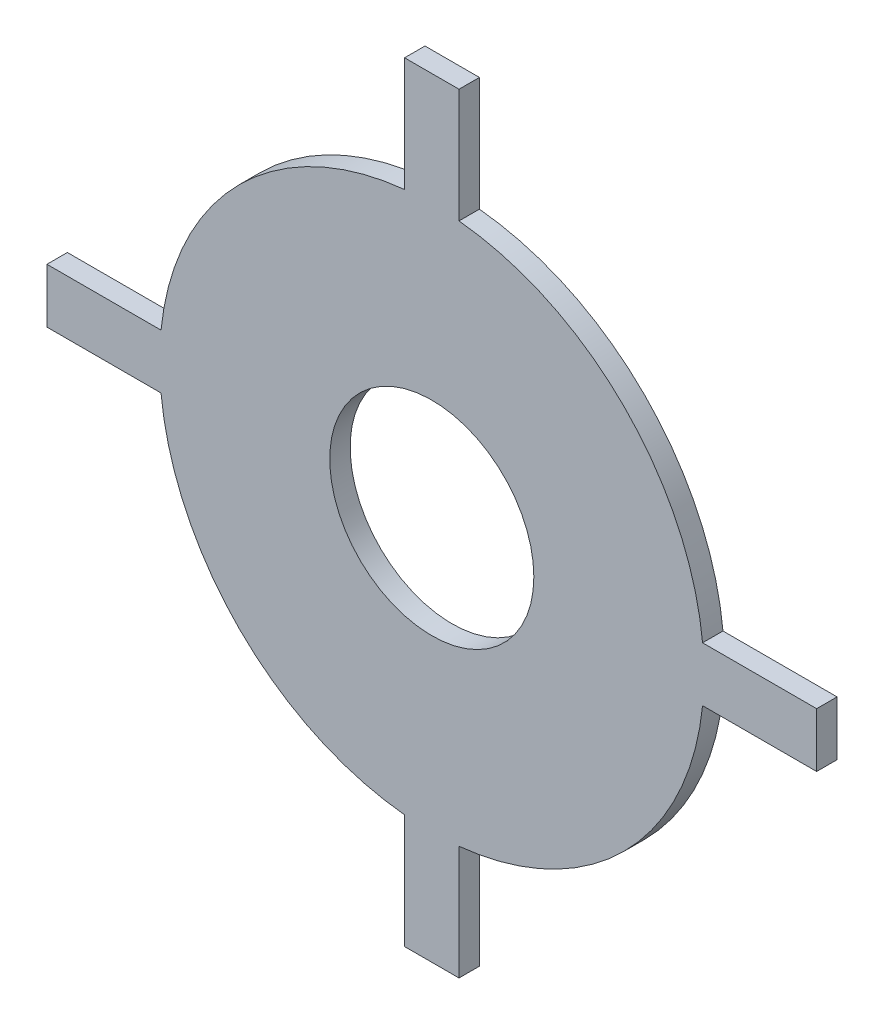
ISO-10303-21;
HEADER;
FILE_DESCRIPTION(('STEP AP214'),'2;1');
FILE_NAME('part.step','',(''),(''),'','','');
FILE_SCHEMA(('AUTOMOTIVE_DESIGN { 1 0 10303 214 1 1 1 1 }'));
ENDSEC;
DATA;
#1=APPLICATION_CONTEXT('core data for automotive mechanical design processes');
#2=APPLICATION_PROTOCOL_DEFINITION('international standard','automotive_design',2000,#1);
#3=PRODUCT_CONTEXT('',#1,'mechanical');
#4=PRODUCT('Part','Part','',(#3));
#5=PRODUCT_RELATED_PRODUCT_CATEGORY('part','',(#4));
#6=PRODUCT_DEFINITION_FORMATION('','',#4);
#7=PRODUCT_DEFINITION_CONTEXT('part definition',#1,'design');
#8=PRODUCT_DEFINITION('design','',#6,#7);
#9=PRODUCT_DEFINITION_SHAPE('','',#8);
#10=(LENGTH_UNIT() NAMED_UNIT(*) SI_UNIT(.MILLI.,.METRE.));
#11=(NAMED_UNIT(*) PLANE_ANGLE_UNIT() SI_UNIT($,.RADIAN.));
#12=(NAMED_UNIT(*) SI_UNIT($,.STERADIAN.) SOLID_ANGLE_UNIT());
#13=UNCERTAINTY_MEASURE_WITH_UNIT(LENGTH_MEASURE(1.E-05),#10,'distance_accuracy_value','');
#14=(GEOMETRIC_REPRESENTATION_CONTEXT(3) GLOBAL_UNCERTAINTY_ASSIGNED_CONTEXT((#13)) GLOBAL_UNIT_ASSIGNED_CONTEXT((#10,
#11,#12)) REPRESENTATION_CONTEXT('',''));
#15=CARTESIAN_POINT('',(0.,0.,0.));
#16=DIRECTION('',(0.,0.,1.));
#17=DIRECTION('',(1.,0.,0.));
#18=AXIS2_PLACEMENT_3D('',#15,#16,#17);
#19=CARTESIAN_POINT('',(0.,0.,1.5));
#20=DIRECTION('',(0.,0.,-1.));
#21=DIRECTION('',(-1.,0.,0.));
#22=AXIS2_PLACEMENT_3D('',#19,#20,#21);
#23=CYLINDRICAL_SURFACE('',#22,20.);
#24=DIRECTION('',(0.,0.,-1.));
#25=VECTOR('',#24,1.);
#26=CARTESIAN_POINT('',(19.8997487421324,-2.,1.5));
#27=LINE('',#26,#25);
#28=CARTESIAN_POINT('',(19.8997487421324,-2.,1.5));
#29=VERTEX_POINT('',#28);
#30=CARTESIAN_POINT('',(19.8997487421324,-2.,0.));
#31=VERTEX_POINT('',#30);
#32=EDGE_CURVE('E11',#29,#31,#27,.T.);
#33=ORIENTED_EDGE('',*,*,#32,.F.);
#34=CARTESIAN_POINT('',(0.,0.,1.5));
#35=DIRECTION('',(0.,0.,1.));
#36=DIRECTION('',(1.,0.,0.));
#37=AXIS2_PLACEMENT_3D('',#34,#35,#36);
#38=CIRCLE('',#37,20.);
#39=CARTESIAN_POINT('',(1.99999999999999,-19.8997487421324,1.5));
#40=VERTEX_POINT('',#39);
#41=EDGE_CURVE('E157',#40,#29,#38,.T.);
#42=ORIENTED_EDGE('',*,*,#41,.F.);
#43=DIRECTION('',(0.,0.,-1.));
#44=VECTOR('',#43,1.);
#45=CARTESIAN_POINT('',(1.99999999999999,-19.8997487421324,1.5));
#46=LINE('',#45,#44);
#47=CARTESIAN_POINT('',(1.99999999999999,-19.8997487421324,0.));
#48=VERTEX_POINT('',#47);
#49=EDGE_CURVE('E56',#48,#40,#46,.F.);
#50=ORIENTED_EDGE('',*,*,#49,.F.);
#51=CARTESIAN_POINT('',(0.,0.,0.));
#52=DIRECTION('',(0.,0.,1.));
#53=DIRECTION('',(1.,0.,0.));
#54=AXIS2_PLACEMENT_3D('',#51,#52,#53);
#55=CIRCLE('',#54,20.);
#56=EDGE_CURVE('E54',#48,#31,#55,.T.);
#57=ORIENTED_EDGE('',*,*,#56,.T.);
#58=EDGE_LOOP('',(#33,#42,#50,#57));
#59=FACE_BOUND('',#58,.T.);
#60=ADVANCED_FACE('F41',(#59),#23,.T.);
#61=DIRECTION('',(0.,0.,-1.));
#62=VECTOR('',#61,1.);
#63=CARTESIAN_POINT('',(19.8997487421324,2.,1.5));
#64=LINE('',#63,#62);
#65=CARTESIAN_POINT('',(19.8997487421324,2.,0.));
#66=VERTEX_POINT('',#65);
#67=CARTESIAN_POINT('',(19.8997487421324,2.,1.5));
#68=VERTEX_POINT('',#67);
#69=EDGE_CURVE('E48',#66,#68,#64,.F.);
#70=ORIENTED_EDGE('',*,*,#69,.F.);
#71=CARTESIAN_POINT('',(2.,19.8997487421324,0.));
#72=VERTEX_POINT('',#71);
#73=EDGE_CURVE('E255',#66,#72,#55,.T.);
#74=ORIENTED_EDGE('',*,*,#73,.T.);
#75=DIRECTION('',(0.,0.,-1.));
#76=VECTOR('',#75,1.);
#77=CARTESIAN_POINT('',(2.,19.8997487421324,1.5));
#78=LINE('',#77,#76);
#79=CARTESIAN_POINT('',(2.,19.8997487421324,1.5));
#80=VERTEX_POINT('',#79);
#81=EDGE_CURVE('E269',#80,#72,#78,.T.);
#82=ORIENTED_EDGE('',*,*,#81,.F.);
#83=EDGE_CURVE('E248',#68,#80,#38,.T.);
#84=ORIENTED_EDGE('',*,*,#83,.F.);
#85=EDGE_LOOP('',(#70,#74,#82,#84));
#86=FACE_BOUND('',#85,.T.);
#87=ADVANCED_FACE('F344',(#86),#23,.T.);
#88=DIRECTION('',(0.,0.,-1.));
#89=VECTOR('',#88,1.);
#90=CARTESIAN_POINT('',(-2.,19.8997487421324,1.5));
#91=LINE('',#90,#89);
#92=CARTESIAN_POINT('',(-2.,19.8997487421324,0.));
#93=VERTEX_POINT('',#92);
#94=CARTESIAN_POINT('',(-2.,19.8997487421324,1.5));
#95=VERTEX_POINT('',#94);
#96=EDGE_CURVE('E270',#93,#95,#91,.F.);
#97=ORIENTED_EDGE('',*,*,#96,.F.);
#98=CARTESIAN_POINT('',(-19.8997487421324,2.,0.));
#99=VERTEX_POINT('',#98);
#100=EDGE_CURVE('E258',#93,#99,#55,.T.);
#101=ORIENTED_EDGE('',*,*,#100,.T.);
#102=DIRECTION('',(0.,0.,-1.));
#103=VECTOR('',#102,1.);
#104=CARTESIAN_POINT('',(-19.8997487421324,2.,1.5));
#105=LINE('',#104,#103);
#106=CARTESIAN_POINT('',(-19.8997487421324,2.,1.5));
#107=VERTEX_POINT('',#106);
#108=EDGE_CURVE('E262',#107,#99,#105,.T.);
#109=ORIENTED_EDGE('',*,*,#108,.F.);
#110=EDGE_CURVE('E251',#95,#107,#38,.T.);
#111=ORIENTED_EDGE('',*,*,#110,.F.);
#112=EDGE_LOOP('',(#97,#101,#109,#111));
#113=FACE_BOUND('',#112,.T.);
#114=ADVANCED_FACE('F298',(#113),#23,.T.);
#115=DIRECTION('',(0.,0.,-1.));
#116=VECTOR('',#115,1.);
#117=CARTESIAN_POINT('',(-19.8997487421324,-2.,1.5));
#118=LINE('',#117,#116);
#119=CARTESIAN_POINT('',(-19.8997487421324,-2.,0.));
#120=VERTEX_POINT('',#119);
#121=CARTESIAN_POINT('',(-19.8997487421324,-2.,1.5));
#122=VERTEX_POINT('',#121);
#123=EDGE_CURVE('E261',#120,#122,#118,.F.);
#124=ORIENTED_EDGE('',*,*,#123,.F.);
#125=CARTESIAN_POINT('',(-2.,-19.8997487421324,0.));
#126=VERTEX_POINT('',#125);
#127=EDGE_CURVE('E305',#120,#126,#55,.T.);
#128=ORIENTED_EDGE('',*,*,#127,.T.);
#129=DIRECTION('',(0.,0.,-1.));
#130=VECTOR('',#129,1.);
#131=CARTESIAN_POINT('',(-2.,-19.8997487421324,1.5));
#132=LINE('',#131,#130);
#133=CARTESIAN_POINT('',(-2.,-19.8997487421324,1.5));
#134=VERTEX_POINT('',#133);
#135=EDGE_CURVE('E256',#134,#126,#132,.T.);
#136=ORIENTED_EDGE('',*,*,#135,.F.);
#137=EDGE_CURVE('E319',#122,#134,#38,.T.);
#138=ORIENTED_EDGE('',*,*,#137,.F.);
#139=EDGE_LOOP('',(#124,#128,#136,#138));
#140=FACE_BOUND('',#139,.T.);
#141=ADVANCED_FACE('F303',(#140),#23,.T.);
#142=CARTESIAN_POINT('',(0.,0.,1.5));
#143=DIRECTION('',(0.,0.,1.));
#144=DIRECTION('',(1.,0.,0.));
#145=AXIS2_PLACEMENT_3D('',#142,#143,#144);
#146=PLANE('',#145);
#147=ORIENTED_EDGE('',*,*,#41,.T.);
#148=DIRECTION('',(1.,0.,0.));
#149=VECTOR('',#148,1.);
#150=CARTESIAN_POINT('',(19.,-2.,1.5));
#151=LINE('',#150,#149);
#152=CARTESIAN_POINT('',(28.2842712474619,-2.,1.5));
#153=VERTEX_POINT('',#152);
#154=EDGE_CURVE('E147',#29,#153,#151,.T.);
#155=ORIENTED_EDGE('',*,*,#154,.T.);
#156=DIRECTION('',(0.,1.,0.));
#157=VECTOR('',#156,1.);
#158=CARTESIAN_POINT('',(28.2842712474619,-2.,1.5));
#159=LINE('',#158,#157);
#160=CARTESIAN_POINT('',(28.2842712474619,2.,1.5));
#161=VERTEX_POINT('',#160);
#162=EDGE_CURVE('E156',#153,#161,#159,.T.);
#163=ORIENTED_EDGE('',*,*,#162,.T.);
#164=DIRECTION('',(-1.,0.,0.));
#165=VECTOR('',#164,1.);
#166=CARTESIAN_POINT('',(19.,2.,1.5));
#167=LINE('',#166,#165);
#168=EDGE_CURVE('E177',#161,#68,#167,.T.);
#169=ORIENTED_EDGE('',*,*,#168,.T.);
#170=ORIENTED_EDGE('',*,*,#83,.T.);
#171=DIRECTION('',(0.,1.,0.));
#172=VECTOR('',#171,1.);
#173=CARTESIAN_POINT('',(2.,19.,1.5));
#174=LINE('',#173,#172);
#175=CARTESIAN_POINT('',(2.,28.2842712474619,1.5));
#176=VERTEX_POINT('',#175);
#177=EDGE_CURVE('E200',#80,#176,#174,.T.);
#178=ORIENTED_EDGE('',*,*,#177,.T.);
#179=DIRECTION('',(-1.,0.,0.));
#180=VECTOR('',#179,1.);
#181=CARTESIAN_POINT('',(2.,28.2842712474619,1.5));
#182=LINE('',#181,#180);
#183=CARTESIAN_POINT('',(-2.,28.2842712474619,1.5));
#184=VERTEX_POINT('',#183);
#185=EDGE_CURVE('E204',#176,#184,#182,.T.);
#186=ORIENTED_EDGE('',*,*,#185,.T.);
#187=DIRECTION('',(0.,-1.,0.));
#188=VECTOR('',#187,1.);
#189=CARTESIAN_POINT('',(-2.,19.,1.5));
#190=LINE('',#189,#188);
#191=EDGE_CURVE('E191',#184,#95,#190,.T.);
#192=ORIENTED_EDGE('',*,*,#191,.T.);
#193=ORIENTED_EDGE('',*,*,#110,.T.);
#194=DIRECTION('',(-1.,0.,0.));
#195=VECTOR('',#194,1.);
#196=CARTESIAN_POINT('',(-19.,2.,1.5));
#197=LINE('',#196,#195);
#198=CARTESIAN_POINT('',(-28.2842712474619,2.,1.5));
#199=VERTEX_POINT('',#198);
#200=EDGE_CURVE('E218',#107,#199,#197,.T.);
#201=ORIENTED_EDGE('',*,*,#200,.T.);
#202=DIRECTION('',(0.,-1.,0.));
#203=VECTOR('',#202,1.);
#204=CARTESIAN_POINT('',(-28.2842712474619,2.,1.5));
#205=LINE('',#204,#203);
#206=CARTESIAN_POINT('',(-28.2842712474619,-2.,1.5));
#207=VERTEX_POINT('',#206);
#208=EDGE_CURVE('E221',#199,#207,#205,.T.);
#209=ORIENTED_EDGE('',*,*,#208,.T.);
#210=DIRECTION('',(1.,0.,0.));
#211=VECTOR('',#210,1.);
#212=CARTESIAN_POINT('',(-19.,-2.,1.5));
#213=LINE('',#212,#211);
#214=EDGE_CURVE('E212',#207,#122,#213,.T.);
#215=ORIENTED_EDGE('',*,*,#214,.T.);
#216=ORIENTED_EDGE('',*,*,#137,.T.);
#217=DIRECTION('',(0.,-1.,0.));
#218=VECTOR('',#217,1.);
#219=CARTESIAN_POINT('',(-2.,-19.,1.5));
#220=LINE('',#219,#218);
#221=CARTESIAN_POINT('',(-2.,-28.2842712474619,1.5));
#222=VERTEX_POINT('',#221);
#223=EDGE_CURVE('E236',#134,#222,#220,.T.);
#224=ORIENTED_EDGE('',*,*,#223,.T.);
#225=DIRECTION('',(1.,0.,0.));
#226=VECTOR('',#225,1.);
#227=CARTESIAN_POINT('',(-2.,-28.2842712474619,1.5));
#228=LINE('',#227,#226);
#229=CARTESIAN_POINT('',(1.99999999999999,-28.2842712474619,1.5));
#230=VERTEX_POINT('',#229);
#231=EDGE_CURVE('E244',#222,#230,#228,.T.);
#232=ORIENTED_EDGE('',*,*,#231,.T.);
#233=DIRECTION('',(0.,1.,0.));
#234=VECTOR('',#233,1.);
#235=CARTESIAN_POINT('',(1.99999999999999,-19.,1.5));
#236=LINE('',#235,#234);
#237=EDGE_CURVE('E234',#230,#40,#236,.T.);
#238=ORIENTED_EDGE('',*,*,#237,.T.);
#239=EDGE_LOOP('',(#147,#155,#163,#169,#170,#178,#186,#192,#193,#201,#209,#215,#216,#224,#232,#238));
#240=FACE_BOUND('',#239,.T.);
#241=CARTESIAN_POINT('',(0.,0.,1.5));
#242=DIRECTION('',(0.,0.,1.));
#243=DIRECTION('',(1.,0.,0.));
#244=AXIS2_PLACEMENT_3D('',#241,#242,#243);
#245=CIRCLE('',#244,7.5);
#246=CARTESIAN_POINT('',(7.5,0.,1.5));
#247=VERTEX_POINT('',#246);
#248=EDGE_CURVE('E241',#247,#247,#245,.T.);
#249=ORIENTED_EDGE('',*,*,#248,.F.);
#250=EDGE_LOOP('',(#249));
#251=FACE_BOUND('',#250,.T.);
#252=ADVANCED_FACE('F155',(#240,#251),#146,.T.);
#253=CARTESIAN_POINT('',(0.,0.,0.));
#254=DIRECTION('',(0.,0.,1.));
#255=DIRECTION('',(1.,0.,0.));
#256=AXIS2_PLACEMENT_3D('',#253,#254,#255);
#257=PLANE('',#256);
#258=ORIENTED_EDGE('',*,*,#73,.F.);
#259=DIRECTION('',(-1.,0.,0.));
#260=VECTOR('',#259,1.);
#261=CARTESIAN_POINT('',(19.,2.,0.));
#262=LINE('',#261,#260);
#263=CARTESIAN_POINT('',(28.2842712474619,2.,0.));
#264=VERTEX_POINT('',#263);
#265=EDGE_CURVE('E161',#264,#66,#262,.T.);
#266=ORIENTED_EDGE('',*,*,#265,.F.);
#267=DIRECTION('',(0.,1.,0.));
#268=VECTOR('',#267,1.);
#269=CARTESIAN_POINT('',(28.2842712474619,-2.,0.));
#270=LINE('',#269,#268);
#271=CARTESIAN_POINT('',(28.2842712474619,-2.,0.));
#272=VERTEX_POINT('',#271);
#273=EDGE_CURVE('E182',#272,#264,#270,.T.);
#274=ORIENTED_EDGE('',*,*,#273,.F.);
#275=DIRECTION('',(1.,0.,0.));
#276=VECTOR('',#275,1.);
#277=CARTESIAN_POINT('',(19.,-2.,0.));
#278=LINE('',#277,#276);
#279=EDGE_CURVE('E170',#31,#272,#278,.T.);
#280=ORIENTED_EDGE('',*,*,#279,.F.);
#281=ORIENTED_EDGE('',*,*,#56,.F.);
#282=DIRECTION('',(0.,1.,0.));
#283=VECTOR('',#282,1.);
#284=CARTESIAN_POINT('',(1.99999999999999,-19.,0.));
#285=LINE('',#284,#283);
#286=CARTESIAN_POINT('',(1.99999999999999,-28.2842712474619,0.));
#287=VERTEX_POINT('',#286);
#288=EDGE_CURVE('E231',#287,#48,#285,.T.);
#289=ORIENTED_EDGE('',*,*,#288,.F.);
#290=DIRECTION('',(1.,0.,0.));
#291=VECTOR('',#290,1.);
#292=CARTESIAN_POINT('',(-2.,-28.2842712474619,0.));
#293=LINE('',#292,#291);
#294=CARTESIAN_POINT('',(-2.,-28.2842712474619,0.));
#295=VERTEX_POINT('',#294);
#296=EDGE_CURVE('E240',#295,#287,#293,.T.);
#297=ORIENTED_EDGE('',*,*,#296,.F.);
#298=DIRECTION('',(0.,-1.,0.));
#299=VECTOR('',#298,1.);
#300=CARTESIAN_POINT('',(-2.,-19.,0.));
#301=LINE('',#300,#299);
#302=EDGE_CURVE('E211',#126,#295,#301,.T.);
#303=ORIENTED_EDGE('',*,*,#302,.F.);
#304=ORIENTED_EDGE('',*,*,#127,.F.);
#305=DIRECTION('',(1.,0.,0.));
#306=VECTOR('',#305,1.);
#307=CARTESIAN_POINT('',(-19.,-2.,0.));
#308=LINE('',#307,#306);
#309=CARTESIAN_POINT('',(-28.2842712474619,-2.,0.));
#310=VERTEX_POINT('',#309);
#311=EDGE_CURVE('E214',#310,#120,#308,.T.);
#312=ORIENTED_EDGE('',*,*,#311,.F.);
#313=DIRECTION('',(0.,-1.,0.));
#314=VECTOR('',#313,1.);
#315=CARTESIAN_POINT('',(-28.2842712474619,2.,0.));
#316=LINE('',#315,#314);
#317=CARTESIAN_POINT('',(-28.2842712474619,2.,0.));
#318=VERTEX_POINT('',#317);
#319=EDGE_CURVE('E217',#318,#310,#316,.T.);
#320=ORIENTED_EDGE('',*,*,#319,.F.);
#321=DIRECTION('',(-1.,0.,0.));
#322=VECTOR('',#321,1.);
#323=CARTESIAN_POINT('',(-19.,2.,0.));
#324=LINE('',#323,#322);
#325=EDGE_CURVE('E192',#99,#318,#324,.T.);
#326=ORIENTED_EDGE('',*,*,#325,.F.);
#327=ORIENTED_EDGE('',*,*,#100,.F.);
#328=DIRECTION('',(0.,-1.,0.));
#329=VECTOR('',#328,1.);
#330=CARTESIAN_POINT('',(-2.,19.,0.));
#331=LINE('',#330,#329);
#332=CARTESIAN_POINT('',(-2.,28.2842712474619,0.));
#333=VERTEX_POINT('',#332);
#334=EDGE_CURVE('E193',#333,#93,#331,.T.);
#335=ORIENTED_EDGE('',*,*,#334,.F.);
#336=DIRECTION('',(-1.,0.,0.));
#337=VECTOR('',#336,1.);
#338=CARTESIAN_POINT('',(2.,28.2842712474619,0.));
#339=LINE('',#338,#337);
#340=CARTESIAN_POINT('',(2.,28.2842712474619,0.));
#341=VERTEX_POINT('',#340);
#342=EDGE_CURVE('E196',#341,#333,#339,.T.);
#343=ORIENTED_EDGE('',*,*,#342,.F.);
#344=DIRECTION('',(0.,1.,0.));
#345=VECTOR('',#344,1.);
#346=CARTESIAN_POINT('',(2.,19.,0.));
#347=LINE('',#346,#345);
#348=EDGE_CURVE('E185',#72,#341,#347,.T.);
#349=ORIENTED_EDGE('',*,*,#348,.F.);
#350=EDGE_LOOP('',(#258,#266,#274,#280,#281,#289,#297,#303,#304,#312,#320,#326,#327,#335,#343,#349));
#351=FACE_BOUND('',#350,.T.);
#352=CARTESIAN_POINT('',(0.,0.,0.));
#353=DIRECTION('',(0.,0.,1.));
#354=DIRECTION('',(1.,0.,0.));
#355=AXIS2_PLACEMENT_3D('',#352,#353,#354);
#356=CIRCLE('',#355,7.5);
#357=CARTESIAN_POINT('',(7.5,0.,0.));
#358=VERTEX_POINT('',#357);
#359=EDGE_CURVE('E168',#358,#358,#356,.T.);
#360=ORIENTED_EDGE('',*,*,#359,.T.);
#361=EDGE_LOOP('',(#360));
#362=FACE_BOUND('',#361,.T.);
#363=ADVANCED_FACE('F300',(#351,#362),#257,.F.);
#364=CARTESIAN_POINT('',(0.,0.,1.5));
#365=DIRECTION('',(0.,0.,-1.));
#366=DIRECTION('',(-1.,0.,0.));
#367=AXIS2_PLACEMENT_3D('',#364,#365,#366);
#368=CYLINDRICAL_SURFACE('',#367,7.5);
#369=ORIENTED_EDGE('',*,*,#248,.T.);
#370=EDGE_LOOP('',(#369));
#371=FACE_BOUND('',#370,.T.);
#372=ORIENTED_EDGE('',*,*,#359,.F.);
#373=EDGE_LOOP('',(#372));
#374=FACE_BOUND('',#373,.T.);
#375=ADVANCED_FACE('F391',(#371,#374),#368,.F.);
#376=CARTESIAN_POINT('',(-2.,-19.,1.5));
#377=DIRECTION('',(1.,0.,0.));
#378=DIRECTION('',(0.,0.,-1.));
#379=AXIS2_PLACEMENT_3D('',#376,#377,#378);
#380=PLANE('',#379);
#381=ORIENTED_EDGE('',*,*,#223,.F.);
#382=ORIENTED_EDGE('',*,*,#135,.T.);
#383=ORIENTED_EDGE('',*,*,#302,.T.);
#384=DIRECTION('',(0.,0.,-1.));
#385=VECTOR('',#384,1.);
#386=CARTESIAN_POINT('',(-2.,-28.2842712474619,1.5));
#387=LINE('',#386,#385);
#388=EDGE_CURVE('E229',#222,#295,#387,.T.);
#389=ORIENTED_EDGE('',*,*,#388,.F.);
#390=EDGE_LOOP('',(#381,#382,#383,#389));
#391=FACE_BOUND('',#390,.T.);
#392=ADVANCED_FACE('F313',(#391),#380,.F.);
#393=CARTESIAN_POINT('',(1.99999999999999,-19.,1.5));
#394=DIRECTION('',(-1.,0.,0.));
#395=DIRECTION('',(0.,0.,1.));
#396=AXIS2_PLACEMENT_3D('',#393,#394,#395);
#397=PLANE('',#396);
#398=ORIENTED_EDGE('',*,*,#288,.T.);
#399=ORIENTED_EDGE('',*,*,#49,.T.);
#400=ORIENTED_EDGE('',*,*,#237,.F.);
#401=DIRECTION('',(0.,0.,-1.));
#402=VECTOR('',#401,1.);
#403=CARTESIAN_POINT('',(1.99999999999999,-28.2842712474619,1.5));
#404=LINE('',#403,#402);
#405=EDGE_CURVE('E226',#230,#287,#404,.T.);
#406=ORIENTED_EDGE('',*,*,#405,.T.);
#407=EDGE_LOOP('',(#398,#399,#400,#406));
#408=FACE_BOUND('',#407,.T.);
#409=ADVANCED_FACE('F337',(#408),#397,.F.);
#410=CARTESIAN_POINT('',(-2.,-28.2842712474619,1.5));
#411=DIRECTION('',(0.,1.,0.));
#412=DIRECTION('',(0.,0.,1.));
#413=AXIS2_PLACEMENT_3D('',#410,#411,#412);
#414=PLANE('',#413);
#415=ORIENTED_EDGE('',*,*,#296,.T.);
#416=ORIENTED_EDGE('',*,*,#405,.F.);
#417=ORIENTED_EDGE('',*,*,#231,.F.);
#418=ORIENTED_EDGE('',*,*,#388,.T.);
#419=EDGE_LOOP('',(#415,#416,#417,#418));
#420=FACE_BOUND('',#419,.T.);
#421=ADVANCED_FACE('F318',(#420),#414,.F.);
#422=CARTESIAN_POINT('',(-19.,2.,1.5));
#423=DIRECTION('',(0.,-1.,0.));
#424=DIRECTION('',(0.,0.,-1.));
#425=AXIS2_PLACEMENT_3D('',#422,#423,#424);
#426=PLANE('',#425);
#427=ORIENTED_EDGE('',*,*,#200,.F.);
#428=ORIENTED_EDGE('',*,*,#108,.T.);
#429=ORIENTED_EDGE('',*,*,#325,.T.);
#430=DIRECTION('',(0.,0.,-1.));
#431=VECTOR('',#430,1.);
#432=CARTESIAN_POINT('',(-28.2842712474619,2.,1.5));
#433=LINE('',#432,#431);
#434=EDGE_CURVE('E210',#199,#318,#433,.T.);
#435=ORIENTED_EDGE('',*,*,#434,.F.);
#436=EDGE_LOOP('',(#427,#428,#429,#435));
#437=FACE_BOUND('',#436,.T.);
#438=ADVANCED_FACE('F329',(#437),#426,.F.);
#439=CARTESIAN_POINT('',(-19.,-2.,1.5));
#440=DIRECTION('',(0.,1.,0.));
#441=DIRECTION('',(0.,0.,1.));
#442=AXIS2_PLACEMENT_3D('',#439,#440,#441);
#443=PLANE('',#442);
#444=ORIENTED_EDGE('',*,*,#311,.T.);
#445=ORIENTED_EDGE('',*,*,#123,.T.);
#446=ORIENTED_EDGE('',*,*,#214,.F.);
#447=DIRECTION('',(0.,0.,-1.));
#448=VECTOR('',#447,1.);
#449=CARTESIAN_POINT('',(-28.2842712474619,-2.,1.5));
#450=LINE('',#449,#448);
#451=EDGE_CURVE('E209',#207,#310,#450,.T.);
#452=ORIENTED_EDGE('',*,*,#451,.T.);
#453=EDGE_LOOP('',(#444,#445,#446,#452));
#454=FACE_BOUND('',#453,.T.);
#455=ADVANCED_FACE('F323',(#454),#443,.F.);
#456=CARTESIAN_POINT('',(-28.2842712474619,2.,1.5));
#457=DIRECTION('',(1.,0.,0.));
#458=DIRECTION('',(0.,0.,-1.));
#459=AXIS2_PLACEMENT_3D('',#456,#457,#458);
#460=PLANE('',#459);
#461=ORIENTED_EDGE('',*,*,#319,.T.);
#462=ORIENTED_EDGE('',*,*,#451,.F.);
#463=ORIENTED_EDGE('',*,*,#208,.F.);
#464=ORIENTED_EDGE('',*,*,#434,.T.);
#465=EDGE_LOOP('',(#461,#462,#463,#464));
#466=FACE_BOUND('',#465,.T.);
#467=ADVANCED_FACE('F326',(#466),#460,.F.);
#468=CARTESIAN_POINT('',(2.,19.,1.5));
#469=DIRECTION('',(-1.,0.,0.));
#470=DIRECTION('',(0.,0.,1.));
#471=AXIS2_PLACEMENT_3D('',#468,#469,#470);
#472=PLANE('',#471);
#473=ORIENTED_EDGE('',*,*,#177,.F.);
#474=ORIENTED_EDGE('',*,*,#81,.T.);
#475=ORIENTED_EDGE('',*,*,#348,.T.);
#476=DIRECTION('',(0.,0.,-1.));
#477=VECTOR('',#476,1.);
#478=CARTESIAN_POINT('',(2.,28.2842712474619,1.5));
#479=LINE('',#478,#477);
#480=EDGE_CURVE('E189',#176,#341,#479,.T.);
#481=ORIENTED_EDGE('',*,*,#480,.F.);
#482=EDGE_LOOP('',(#473,#474,#475,#481));
#483=FACE_BOUND('',#482,.T.);
#484=ADVANCED_FACE('F284',(#483),#472,.F.);
#485=CARTESIAN_POINT('',(-2.,19.,1.5));
#486=DIRECTION('',(1.,0.,0.));
#487=DIRECTION('',(0.,0.,-1.));
#488=AXIS2_PLACEMENT_3D('',#485,#486,#487);
#489=PLANE('',#488);
#490=ORIENTED_EDGE('',*,*,#334,.T.);
#491=ORIENTED_EDGE('',*,*,#96,.T.);
#492=ORIENTED_EDGE('',*,*,#191,.F.);
#493=DIRECTION('',(0.,0.,-1.));
#494=VECTOR('',#493,1.);
#495=CARTESIAN_POINT('',(-2.,28.2842712474619,1.5));
#496=LINE('',#495,#494);
#497=EDGE_CURVE('E186',#184,#333,#496,.T.);
#498=ORIENTED_EDGE('',*,*,#497,.T.);
#499=EDGE_LOOP('',(#490,#491,#492,#498));
#500=FACE_BOUND('',#499,.T.);
#501=ADVANCED_FACE('F295',(#500),#489,.F.);
#502=CARTESIAN_POINT('',(2.,28.2842712474619,1.5));
#503=DIRECTION('',(0.,-1.,0.));
#504=DIRECTION('',(0.,0.,-1.));
#505=AXIS2_PLACEMENT_3D('',#502,#503,#504);
#506=PLANE('',#505);
#507=ORIENTED_EDGE('',*,*,#342,.T.);
#508=ORIENTED_EDGE('',*,*,#497,.F.);
#509=ORIENTED_EDGE('',*,*,#185,.F.);
#510=ORIENTED_EDGE('',*,*,#480,.T.);
#511=EDGE_LOOP('',(#507,#508,#509,#510));
#512=FACE_BOUND('',#511,.T.);
#513=ADVANCED_FACE('F287',(#512),#506,.F.);
#514=CARTESIAN_POINT('',(19.,-2.,1.5));
#515=DIRECTION('',(0.,1.,0.));
#516=DIRECTION('',(0.,0.,1.));
#517=AXIS2_PLACEMENT_3D('',#514,#515,#516);
#518=PLANE('',#517);
#519=ORIENTED_EDGE('',*,*,#154,.F.);
#520=ORIENTED_EDGE('',*,*,#32,.T.);
#521=ORIENTED_EDGE('',*,*,#279,.T.);
#522=DIRECTION('',(0.,0.,-1.));
#523=VECTOR('',#522,1.);
#524=CARTESIAN_POINT('',(28.2842712474619,-2.,1.5));
#525=LINE('',#524,#523);
#526=EDGE_CURVE('E163',#153,#272,#525,.T.);
#527=ORIENTED_EDGE('',*,*,#526,.F.);
#528=EDGE_LOOP('',(#519,#520,#521,#527));
#529=FACE_BOUND('',#528,.T.);
#530=ADVANCED_FACE('F164',(#529),#518,.F.);
#531=CARTESIAN_POINT('',(19.,2.,1.5));
#532=DIRECTION('',(0.,-1.,0.));
#533=DIRECTION('',(0.,0.,-1.));
#534=AXIS2_PLACEMENT_3D('',#531,#532,#533);
#535=PLANE('',#534);
#536=ORIENTED_EDGE('',*,*,#265,.T.);
#537=ORIENTED_EDGE('',*,*,#69,.T.);
#538=ORIENTED_EDGE('',*,*,#168,.F.);
#539=DIRECTION('',(0.,0.,-1.));
#540=VECTOR('',#539,1.);
#541=CARTESIAN_POINT('',(28.2842712474619,2.,1.5));
#542=LINE('',#541,#540);
#543=EDGE_CURVE('E173',#161,#264,#542,.T.);
#544=ORIENTED_EDGE('',*,*,#543,.T.);
#545=EDGE_LOOP('',(#536,#537,#538,#544));
#546=FACE_BOUND('',#545,.T.);
#547=ADVANCED_FACE('F273',(#546),#535,.F.);
#548=CARTESIAN_POINT('',(28.2842712474619,-2.,1.5));
#549=DIRECTION('',(-1.,0.,0.));
#550=DIRECTION('',(0.,0.,1.));
#551=AXIS2_PLACEMENT_3D('',#548,#549,#550);
#552=PLANE('',#551);
#553=ORIENTED_EDGE('',*,*,#273,.T.);
#554=ORIENTED_EDGE('',*,*,#543,.F.);
#555=ORIENTED_EDGE('',*,*,#162,.F.);
#556=ORIENTED_EDGE('',*,*,#526,.T.);
#557=EDGE_LOOP('',(#553,#554,#555,#556));
#558=FACE_BOUND('',#557,.T.);
#559=ADVANCED_FACE('F172',(#558),#552,.F.);
#560=CLOSED_SHELL('',(#60,#87,#114,#141,#252,#363,#375,#392,#409,#421,#438,#455,#467,#484,#501,
#513,#530,#547,#559));
#561=MANIFOLD_SOLID_BREP('B2',#560);
#562=ADVANCED_BREP_SHAPE_REPRESENTATION('',(#18,#561),#14);
#563=SHAPE_DEFINITION_REPRESENTATION(#9,#562);
ENDSEC;
END-ISO-10303-21;
